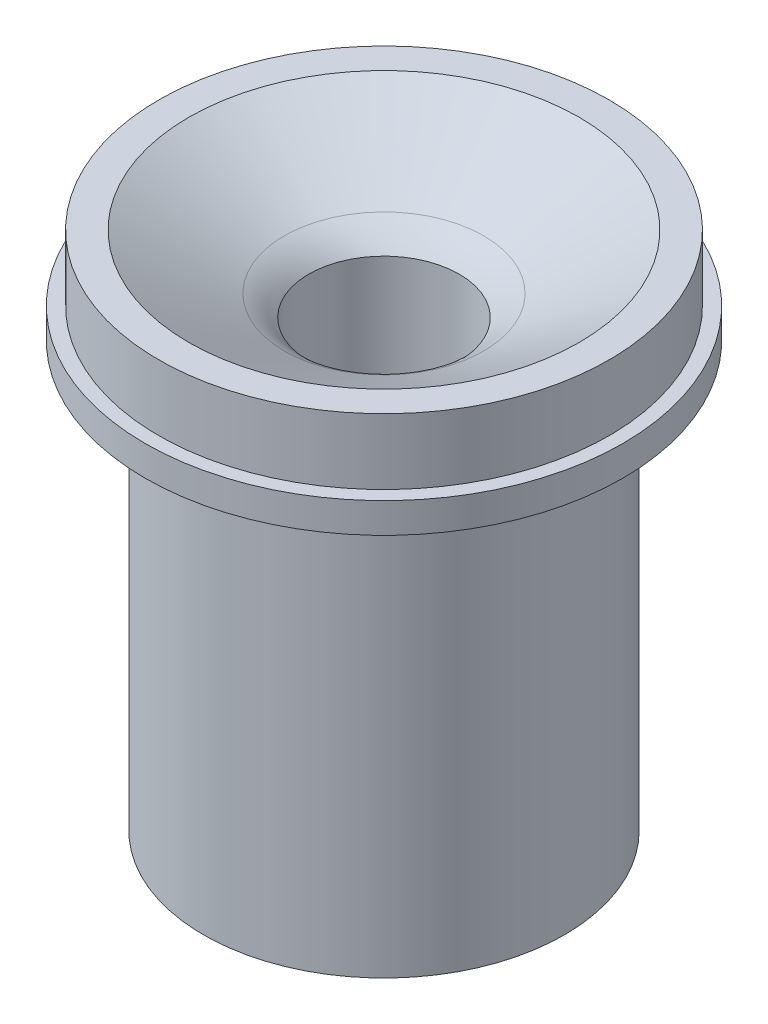
ISO-10303-21;
HEADER;
FILE_DESCRIPTION(('STEP AP214'),'2;1');
FILE_NAME('part.step','',(''),(''),'','','');
FILE_SCHEMA(('AUTOMOTIVE_DESIGN { 1 0 10303 214 1 1 1 1 }'));
ENDSEC;
DATA;
#1=APPLICATION_CONTEXT('core data for automotive mechanical design processes');
#2=APPLICATION_PROTOCOL_DEFINITION('international standard','automotive_design',2000,#1);
#3=PRODUCT_CONTEXT('',#1,'mechanical');
#4=PRODUCT('Part','Part','',(#3));
#5=PRODUCT_RELATED_PRODUCT_CATEGORY('part','',(#4));
#6=PRODUCT_DEFINITION_FORMATION('','',#4);
#7=PRODUCT_DEFINITION_CONTEXT('part definition',#1,'design');
#8=PRODUCT_DEFINITION('design','',#6,#7);
#9=PRODUCT_DEFINITION_SHAPE('','',#8);
#10=(LENGTH_UNIT() NAMED_UNIT(*) SI_UNIT(.MILLI.,.METRE.));
#11=(NAMED_UNIT(*) PLANE_ANGLE_UNIT() SI_UNIT($,.RADIAN.));
#12=(NAMED_UNIT(*) SI_UNIT($,.STERADIAN.) SOLID_ANGLE_UNIT());
#13=UNCERTAINTY_MEASURE_WITH_UNIT(LENGTH_MEASURE(1.E-05),#10,'distance_accuracy_value','');
#14=(GEOMETRIC_REPRESENTATION_CONTEXT(3) GLOBAL_UNCERTAINTY_ASSIGNED_CONTEXT((#13)) GLOBAL_UNIT_ASSIGNED_CONTEXT((#10,
#11,#12)) REPRESENTATION_CONTEXT('',''));
#15=CARTESIAN_POINT('',(0.,0.,0.));
#16=DIRECTION('',(0.,0.,1.));
#17=DIRECTION('',(1.,0.,0.));
#18=AXIS2_PLACEMENT_3D('',#15,#16,#17);
#19=CARTESIAN_POINT('',(0.,-11.8872,0.));
#20=DIRECTION('',(0.,1.,0.));
#21=DIRECTION('',(0.,0.,1.));
#22=AXIS2_PLACEMENT_3D('',#19,#20,#21);
#23=CONICAL_SURFACE('',#22,20.447,0.785398163397446);
#24=CARTESIAN_POINT('',(0.,-13.2842,0.));
#25=DIRECTION('',(0.,-1.,0.));
#26=DIRECTION('',(0.,0.,-1.));
#27=AXIS2_PLACEMENT_3D('',#24,#25,#26);
#28=CIRCLE('',#27,19.05);
#29=CARTESIAN_POINT('',(0.,-13.2842,-19.05));
#30=VERTEX_POINT('',#29);
#31=EDGE_CURVE('E100',#30,#30,#28,.T.);
#32=ORIENTED_EDGE('',*,*,#31,.F.);
#33=EDGE_LOOP('',(#32));
#34=FACE_BOUND('',#33,.T.);
#35=CARTESIAN_POINT('',(0.,-11.8872,0.));
#36=DIRECTION('',(0.,-1.,0.));
#37=DIRECTION('',(0.,0.,-1.));
#38=AXIS2_PLACEMENT_3D('',#35,#36,#37);
#39=CIRCLE('',#38,20.447);
#40=CARTESIAN_POINT('',(0.,-11.8872,-20.447));
#41=VERTEX_POINT('',#40);
#42=EDGE_CURVE('E10',#41,#41,#39,.T.);
#43=ORIENTED_EDGE('',*,*,#42,.T.);
#44=EDGE_LOOP('',(#43));
#45=FACE_BOUND('',#44,.T.);
#46=ADVANCED_FACE('F49',(#34,#45),#23,.T.);
#47=CARTESIAN_POINT('',(0.,-11.8872,0.));
#48=DIRECTION('',(0.,1.,0.));
#49=DIRECTION('',(0.,0.,1.));
#50=AXIS2_PLACEMENT_3D('',#47,#48,#49);
#51=PLANE('',#50);
#52=ORIENTED_EDGE('',*,*,#42,.F.);
#53=EDGE_LOOP('',(#52));
#54=FACE_BOUND('',#53,.T.);
#55=CARTESIAN_POINT('',(0.,-11.8872,0.));
#56=DIRECTION('',(0.,-1.,0.));
#57=DIRECTION('',(0.,0.,-1.));
#58=AXIS2_PLACEMENT_3D('',#55,#56,#57);
#59=CIRCLE('',#58,22.2123);
#60=CARTESIAN_POINT('',(0.,-11.8872,-22.2123));
#61=VERTEX_POINT('',#60);
#62=EDGE_CURVE('E57',#61,#61,#59,.T.);
#63=ORIENTED_EDGE('',*,*,#62,.T.);
#64=EDGE_LOOP('',(#63));
#65=FACE_BOUND('',#64,.T.);
#66=ADVANCED_FACE('F129',(#54,#65),#51,.F.);
#67=CARTESIAN_POINT('',(0.,0.,0.));
#68=DIRECTION('',(0.,-1.,0.));
#69=DIRECTION('',(0.,0.,-1.));
#70=AXIS2_PLACEMENT_3D('',#67,#68,#69);
#71=CYLINDRICAL_SURFACE('',#70,22.2123);
#72=ORIENTED_EDGE('',*,*,#62,.F.);
#73=EDGE_LOOP('',(#72));
#74=FACE_BOUND('',#73,.T.);
#75=CARTESIAN_POINT('',(0.,-10.1092,0.));
#76=DIRECTION('',(0.,-1.,0.));
#77=DIRECTION('',(0.,0.,-1.));
#78=AXIS2_PLACEMENT_3D('',#75,#76,#77);
#79=CIRCLE('',#78,22.2123);
#80=CARTESIAN_POINT('',(0.,-10.1092,-22.2123));
#81=VERTEX_POINT('',#80);
#82=EDGE_CURVE('E62',#81,#81,#79,.T.);
#83=ORIENTED_EDGE('',*,*,#82,.T.);
#84=EDGE_LOOP('',(#83));
#85=FACE_BOUND('',#84,.T.);
#86=ADVANCED_FACE('F134',(#74,#85),#71,.T.);
#87=CARTESIAN_POINT('',(0.,-10.1092,0.));
#88=DIRECTION('',(0.,1.,0.));
#89=DIRECTION('',(0.,0.,1.));
#90=AXIS2_PLACEMENT_3D('',#87,#88,#89);
#91=PLANE('',#90);
#92=ORIENTED_EDGE('',*,*,#82,.F.);
#93=EDGE_LOOP('',(#92));
#94=FACE_BOUND('',#93,.T.);
#95=CARTESIAN_POINT('',(0.,-10.1092,0.));
#96=DIRECTION('',(0.,-1.,0.));
#97=DIRECTION('',(0.,0.,-1.));
#98=AXIS2_PLACEMENT_3D('',#95,#96,#97);
#99=CIRCLE('',#98,25.2095);
#100=CARTESIAN_POINT('',(0.,-10.1092,-25.2095));
#101=VERTEX_POINT('',#100);
#102=EDGE_CURVE('E68',#101,#101,#99,.T.);
#103=ORIENTED_EDGE('',*,*,#102,.T.);
#104=EDGE_LOOP('',(#103));
#105=FACE_BOUND('',#104,.T.);
#106=ADVANCED_FACE('F141',(#94,#105),#91,.F.);
#107=CARTESIAN_POINT('',(0.,0.,0.));
#108=DIRECTION('',(0.,-1.,0.));
#109=DIRECTION('',(0.,0.,-1.));
#110=AXIS2_PLACEMENT_3D('',#107,#108,#109);
#111=CYLINDRICAL_SURFACE('',#110,25.2095);
#112=ORIENTED_EDGE('',*,*,#102,.F.);
#113=EDGE_LOOP('',(#112));
#114=FACE_BOUND('',#113,.T.);
#115=CARTESIAN_POINT('',(0.,-6.9342,0.));
#116=DIRECTION('',(0.,-1.,0.));
#117=DIRECTION('',(0.,0.,-1.));
#118=AXIS2_PLACEMENT_3D('',#115,#116,#117);
#119=CIRCLE('',#118,25.2095);
#120=CARTESIAN_POINT('',(0.,-6.9342,-25.2095));
#121=VERTEX_POINT('',#120);
#122=EDGE_CURVE('E72',#121,#121,#119,.T.);
#123=ORIENTED_EDGE('',*,*,#122,.T.);
#124=EDGE_LOOP('',(#123));
#125=FACE_BOUND('',#124,.T.);
#126=ADVANCED_FACE('F148',(#114,#125),#111,.T.);
#127=CARTESIAN_POINT('',(0.,-6.9342,0.));
#128=DIRECTION('',(0.,-1.,0.));
#129=DIRECTION('',(0.,0.,-1.));
#130=AXIS2_PLACEMENT_3D('',#127,#128,#129);
#131=PLANE('',#130);
#132=ORIENTED_EDGE('',*,*,#122,.F.);
#133=EDGE_LOOP('',(#132));
#134=FACE_BOUND('',#133,.T.);
#135=CARTESIAN_POINT('',(0.,-6.9342,0.));
#136=DIRECTION('',(0.,-1.,0.));
#137=DIRECTION('',(0.,0.,-1.));
#138=AXIS2_PLACEMENT_3D('',#135,#136,#137);
#139=CIRCLE('',#138,23.7744);
#140=CARTESIAN_POINT('',(0.,-6.9342,-23.7744));
#141=VERTEX_POINT('',#140);
#142=EDGE_CURVE('E76',#141,#141,#139,.T.);
#143=ORIENTED_EDGE('',*,*,#142,.T.);
#144=EDGE_LOOP('',(#143));
#145=FACE_BOUND('',#144,.T.);
#146=ADVANCED_FACE('F152',(#134,#145),#131,.F.);
#147=CARTESIAN_POINT('',(0.,0.,0.));
#148=DIRECTION('',(0.,-1.,0.));
#149=DIRECTION('',(0.,0.,-1.));
#150=AXIS2_PLACEMENT_3D('',#147,#148,#149);
#151=CYLINDRICAL_SURFACE('',#150,23.7744);
#152=ORIENTED_EDGE('',*,*,#142,.F.);
#153=EDGE_LOOP('',(#152));
#154=FACE_BOUND('',#153,.T.);
#155=CARTESIAN_POINT('',(0.,0.,0.));
#156=DIRECTION('',(0.,-1.,0.));
#157=DIRECTION('',(0.,0.,-1.));
#158=AXIS2_PLACEMENT_3D('',#155,#156,#157);
#159=CIRCLE('',#158,23.7744);
#160=CARTESIAN_POINT('',(0.,0.,-23.7744));
#161=VERTEX_POINT('',#160);
#162=EDGE_CURVE('E80',#161,#161,#159,.T.);
#163=ORIENTED_EDGE('',*,*,#162,.T.);
#164=EDGE_LOOP('',(#163));
#165=FACE_BOUND('',#164,.T.);
#166=ADVANCED_FACE('F156',(#154,#165),#151,.T.);
#167=CARTESIAN_POINT('',(0.,0.,0.));
#168=DIRECTION('',(0.,-1.,0.));
#169=DIRECTION('',(0.,0.,-1.));
#170=AXIS2_PLACEMENT_3D('',#167,#168,#169);
#171=PLANE('',#170);
#172=ORIENTED_EDGE('',*,*,#162,.F.);
#173=EDGE_LOOP('',(#172));
#174=FACE_BOUND('',#173,.T.);
#175=CARTESIAN_POINT('',(0.,0.,0.));
#176=DIRECTION('',(0.,-1.,0.));
#177=DIRECTION('',(0.,0.,-1.));
#178=AXIS2_PLACEMENT_3D('',#175,#176,#177);
#179=CIRCLE('',#178,20.5994);
#180=CARTESIAN_POINT('',(0.,0.,-20.5994));
#181=VERTEX_POINT('',#180);
#182=EDGE_CURVE('E84',#181,#181,#179,.T.);
#183=ORIENTED_EDGE('',*,*,#182,.T.);
#184=EDGE_LOOP('',(#183));
#185=FACE_BOUND('',#184,.T.);
#186=ADVANCED_FACE('F160',(#174,#185),#171,.F.);
#187=CARTESIAN_POINT('',(0.,-5.811029796971,0.));
#188=DIRECTION('',(0.,1.,0.));
#189=DIRECTION('',(0.,0.,1.));
#190=AXIS2_PLACEMENT_3D('',#187,#188,#189);
#191=CONICAL_SURFACE('',#190,10.5344011473496,1.0471975511966);
#192=ORIENTED_EDGE('',*,*,#182,.F.);
#193=EDGE_LOOP('',(#192));
#194=FACE_BOUND('',#193,.T.);
#195=CARTESIAN_POINT('',(0.,-5.811029796971,0.));
#196=DIRECTION('',(0.,-1.,0.));
#197=DIRECTION('',(0.,0.,-1.));
#198=AXIS2_PLACEMENT_3D('',#195,#196,#197);
#199=CIRCLE('',#198,10.5344011473496);
#200=CARTESIAN_POINT('',(0.,-5.811029796971,-10.5344011473496));
#201=VERTEX_POINT('',#200);
#202=EDGE_CURVE('E88',#201,#201,#199,.T.);
#203=ORIENTED_EDGE('',*,*,#202,.T.);
#204=EDGE_LOOP('',(#203));
#205=FACE_BOUND('',#204,.T.);
#206=ADVANCED_FACE('F164',(#194,#205),#191,.F.);
#207=CARTESIAN_POINT('',(0.,-14.0599217680178,0.));
#208=DIRECTION('',(0.,-1.,0.));
#209=DIRECTION('',(0.,0.,-1.));
#210=AXIS2_PLACEMENT_3D('',#207,#208,#209);
#211=TOROIDAL_SURFACE('',#210,15.2969011473495,9.52499999999999);
#212=CARTESIAN_POINT('',(0.,-8.01303498617786,0.));
#213=DIRECTION('',(0.,-1.,0.));
#214=DIRECTION('',(0.,0.,-1.));
#215=AXIS2_PLACEMENT_3D('',#212,#213,#214);
#216=CIRCLE('',#215,7.9375);
#217=CARTESIAN_POINT('',(0.,-8.01303498617786,-7.9375));
#218=VERTEX_POINT('',#217);
#219=EDGE_CURVE('E104',#218,#218,#216,.T.);
#220=ORIENTED_EDGE('',*,*,#219,.T.);
#221=EDGE_LOOP('',(#220));
#222=FACE_BOUND('',#221,.T.);
#223=ORIENTED_EDGE('',*,*,#202,.F.);
#224=EDGE_LOOP('',(#223));
#225=FACE_BOUND('',#224,.T.);
#226=ADVANCED_FACE('F168',(#222,#225),#211,.T.);
#227=CARTESIAN_POINT('',(0.,-54.9402,0.));
#228=DIRECTION('',(0.,-1.,0.));
#229=DIRECTION('',(0.,0.,-1.));
#230=AXIS2_PLACEMENT_3D('',#227,#228,#229);
#231=CONICAL_SURFACE('',#230,15.875,0.26179938779915);
#232=CARTESIAN_POINT('',(0.,-25.3170467149221,0.));
#233=DIRECTION('',(0.,-1.,0.));
#234=DIRECTION('',(0.,0.,-1.));
#235=AXIS2_PLACEMENT_3D('',#232,#233,#234);
#236=CIRCLE('',#235,7.9375);
#237=CARTESIAN_POINT('',(0.,-25.3170467149221,-7.9375));
#238=VERTEX_POINT('',#237);
#239=EDGE_CURVE('E52',#238,#238,#236,.F.);
#240=ORIENTED_EDGE('',*,*,#239,.T.);
#241=EDGE_LOOP('',(#240));
#242=FACE_BOUND('',#241,.T.);
#243=CARTESIAN_POINT('',(0.,-54.9402,0.));
#244=DIRECTION('',(0.,-1.,0.));
#245=DIRECTION('',(0.,0.,-1.));
#246=AXIS2_PLACEMENT_3D('',#243,#244,#245);
#247=CIRCLE('',#246,15.875);
#248=CARTESIAN_POINT('',(0.,-54.9402,-15.875));
#249=VERTEX_POINT('',#248);
#250=EDGE_CURVE('E92',#249,#249,#247,.T.);
#251=ORIENTED_EDGE('',*,*,#250,.T.);
#252=EDGE_LOOP('',(#251));
#253=FACE_BOUND('',#252,.T.);
#254=ADVANCED_FACE('F113',(#242,#253),#231,.F.);
#255=CARTESIAN_POINT('',(0.,-54.9402,0.));
#256=DIRECTION('',(0.,-1.,0.));
#257=DIRECTION('',(0.,0.,-1.));
#258=AXIS2_PLACEMENT_3D('',#255,#256,#257);
#259=PLANE('',#258);
#260=CARTESIAN_POINT('',(0.,-54.9402,0.));
#261=DIRECTION('',(0.,-1.,0.));
#262=DIRECTION('',(0.,0.,-1.));
#263=AXIS2_PLACEMENT_3D('',#260,#261,#262);
#264=CIRCLE('',#263,19.05);
#265=CARTESIAN_POINT('',(0.,-54.9402,-19.05));
#266=VERTEX_POINT('',#265);
#267=EDGE_CURVE('E96',#266,#266,#264,.T.);
#268=ORIENTED_EDGE('',*,*,#267,.T.);
#269=EDGE_LOOP('',(#268));
#270=FACE_BOUND('',#269,.T.);
#271=ORIENTED_EDGE('',*,*,#250,.F.);
#272=EDGE_LOOP('',(#271));
#273=FACE_BOUND('',#272,.T.);
#274=ADVANCED_FACE('F125',(#270,#273),#259,.T.);
#275=CARTESIAN_POINT('',(0.,0.,0.));
#276=DIRECTION('',(0.,-1.,0.));
#277=DIRECTION('',(0.,0.,-1.));
#278=AXIS2_PLACEMENT_3D('',#275,#276,#277);
#279=CYLINDRICAL_SURFACE('',#278,19.05);
#280=ORIENTED_EDGE('',*,*,#267,.F.);
#281=EDGE_LOOP('',(#280));
#282=FACE_BOUND('',#281,.T.);
#283=ORIENTED_EDGE('',*,*,#31,.T.);
#284=EDGE_LOOP('',(#283));
#285=FACE_BOUND('',#284,.T.);
#286=ADVANCED_FACE('F119',(#282,#285),#279,.T.);
#287=CARTESIAN_POINT('',(0.,-54.9402,0.));
#288=DIRECTION('',(0.,1.,0.));
#289=DIRECTION('',(0.,0.,1.));
#290=AXIS2_PLACEMENT_3D('',#287,#288,#289);
#291=CYLINDRICAL_SURFACE('',#290,7.9375);
#292=ORIENTED_EDGE('',*,*,#239,.F.);
#293=EDGE_LOOP('',(#292));
#294=FACE_BOUND('',#293,.T.);
#295=ORIENTED_EDGE('',*,*,#219,.F.);
#296=EDGE_LOOP('',(#295));
#297=FACE_BOUND('',#296,.T.);
#298=ADVANCED_FACE('F116',(#294,#297),#291,.F.);
#299=CLOSED_SHELL('',(#46,#66,#86,#106,#126,#146,#166,#186,#206,#226,#254,#274,#286,#298));
#300=MANIFOLD_SOLID_BREP('B2',#299);
#301=ADVANCED_BREP_SHAPE_REPRESENTATION('',(#18,#300),#14);
#302=SHAPE_DEFINITION_REPRESENTATION(#9,#301);
ENDSEC;
END-ISO-10303-21;
